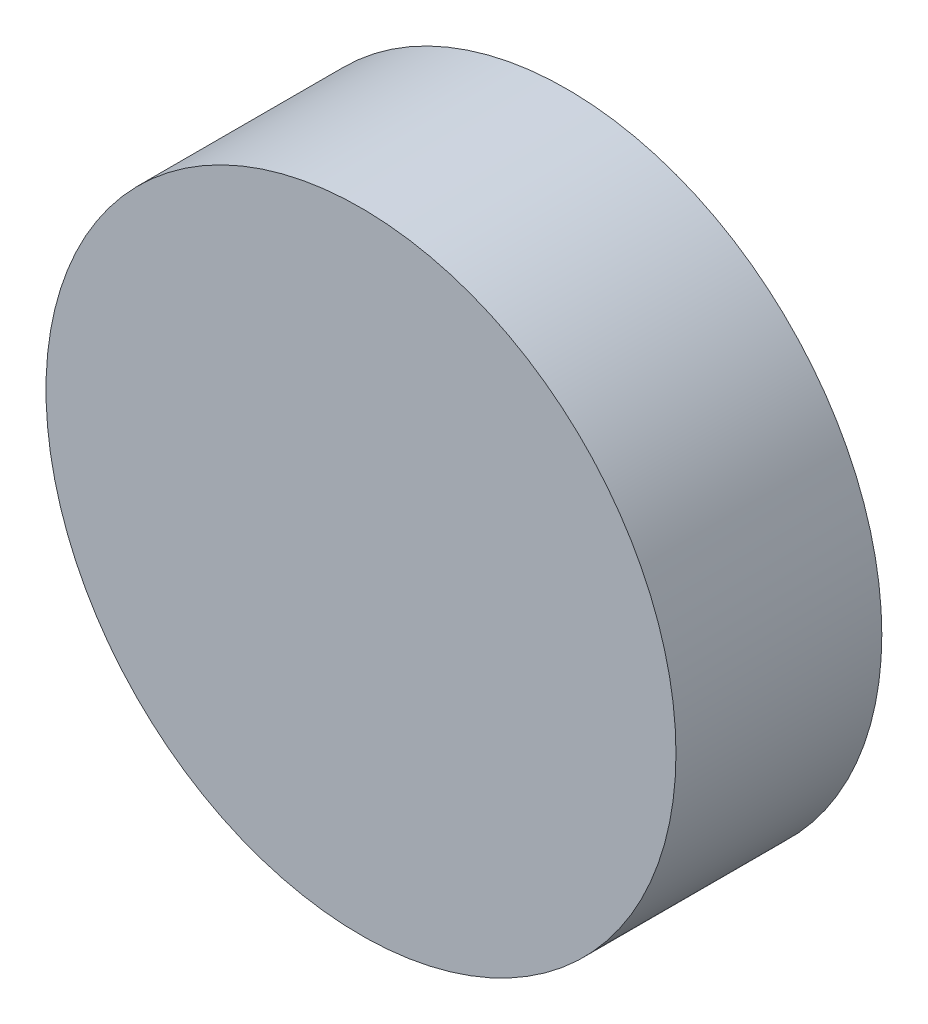
ISO-10303-21;
HEADER;
FILE_DESCRIPTION(('STEP AP214'),'2;1');
FILE_NAME('part.step','',(''),(''),'','','');
FILE_SCHEMA(('AUTOMOTIVE_DESIGN { 1 0 10303 214 1 1 1 1 }'));
ENDSEC;
DATA;
#1=APPLICATION_CONTEXT('core data for automotive mechanical design processes');
#2=APPLICATION_PROTOCOL_DEFINITION('international standard','automotive_design',2000,#1);
#3=PRODUCT_CONTEXT('',#1,'mechanical');
#4=PRODUCT('Part','Part','',(#3));
#5=PRODUCT_RELATED_PRODUCT_CATEGORY('part','',(#4));
#6=PRODUCT_DEFINITION_FORMATION('','',#4);
#7=PRODUCT_DEFINITION_CONTEXT('part definition',#1,'design');
#8=PRODUCT_DEFINITION('design','',#6,#7);
#9=PRODUCT_DEFINITION_SHAPE('','',#8);
#10=(LENGTH_UNIT() NAMED_UNIT(*) SI_UNIT(.MILLI.,.METRE.));
#11=(NAMED_UNIT(*) PLANE_ANGLE_UNIT() SI_UNIT($,.RADIAN.));
#12=(NAMED_UNIT(*) SI_UNIT($,.STERADIAN.) SOLID_ANGLE_UNIT());
#13=UNCERTAINTY_MEASURE_WITH_UNIT(LENGTH_MEASURE(1.E-05),#10,'distance_accuracy_value','');
#14=(GEOMETRIC_REPRESENTATION_CONTEXT(3) GLOBAL_UNCERTAINTY_ASSIGNED_CONTEXT((#13)) GLOBAL_UNIT_ASSIGNED_CONTEXT((#10,
#11,#12)) REPRESENTATION_CONTEXT('',''));
#15=CARTESIAN_POINT('',(0.,0.,0.));
#16=DIRECTION('',(0.,0.,1.));
#17=DIRECTION('',(1.,0.,0.));
#18=AXIS2_PLACEMENT_3D('',#15,#16,#17);
#19=CARTESIAN_POINT('',(0.,0.,0.));
#20=DIRECTION('',(0.,0.,1.));
#21=DIRECTION('',(1.,0.,0.));
#22=AXIS2_PLACEMENT_3D('',#19,#20,#21);
#23=PLANE('',#22);
#24=CARTESIAN_POINT('',(0.,0.,0.));
#25=DIRECTION('',(0.,0.,1.));
#26=DIRECTION('',(1.,0.,0.));
#27=AXIS2_PLACEMENT_3D('',#24,#25,#26);
#28=CIRCLE('',#27,81.1);
#29=CARTESIAN_POINT('',(81.1,0.,0.));
#30=VERTEX_POINT('',#29);
#31=EDGE_CURVE('E10',#30,#30,#28,.T.);
#32=ORIENTED_EDGE('',*,*,#31,.F.);
#33=EDGE_LOOP('',(#32));
#34=FACE_BOUND('',#33,.T.);
#35=CARTESIAN_POINT('',(0.,0.,0.));
#36=DIRECTION('',(0.,0.,1.));
#37=DIRECTION('',(1.,0.,0.));
#38=AXIS2_PLACEMENT_3D('',#35,#36,#37);
#39=CIRCLE('',#38,78.1);
#40=CARTESIAN_POINT('',(78.1,0.,0.));
#41=VERTEX_POINT('',#40);
#42=EDGE_CURVE('E45',#41,#41,#39,.T.);
#43=ORIENTED_EDGE('',*,*,#42,.T.);
#44=EDGE_LOOP('',(#43));
#45=FACE_BOUND('',#44,.T.);
#46=ADVANCED_FACE('F37',(#34,#45),#23,.F.);
#47=CARTESIAN_POINT('',(0.,0.,50.));
#48=DIRECTION('',(0.,0.,-1.));
#49=DIRECTION('',(-1.,0.,0.));
#50=AXIS2_PLACEMENT_3D('',#47,#48,#49);
#51=CYLINDRICAL_SURFACE('',#50,81.1);
#52=ORIENTED_EDGE('',*,*,#31,.T.);
#53=EDGE_LOOP('',(#52));
#54=FACE_BOUND('',#53,.T.);
#55=CARTESIAN_POINT('',(0.,0.,53.));
#56=DIRECTION('',(0.,0.,1.));
#57=DIRECTION('',(1.,0.,0.));
#58=AXIS2_PLACEMENT_3D('',#55,#56,#57);
#59=CIRCLE('',#58,81.1);
#60=CARTESIAN_POINT('',(81.1,0.,53.));
#61=VERTEX_POINT('',#60);
#62=EDGE_CURVE('E55',#61,#61,#59,.T.);
#63=ORIENTED_EDGE('',*,*,#62,.F.);
#64=EDGE_LOOP('',(#63));
#65=FACE_BOUND('',#64,.T.);
#66=ADVANCED_FACE('F39',(#54,#65),#51,.T.);
#67=CARTESIAN_POINT('',(0.,0.,50.));
#68=DIRECTION('',(0.,0.,-1.));
#69=DIRECTION('',(-1.,0.,0.));
#70=AXIS2_PLACEMENT_3D('',#67,#68,#69);
#71=CYLINDRICAL_SURFACE('',#70,78.1);
#72=CARTESIAN_POINT('',(0.,0.,50.));
#73=DIRECTION('',(0.,0.,1.));
#74=DIRECTION('',(1.,0.,0.));
#75=AXIS2_PLACEMENT_3D('',#72,#73,#74);
#76=CIRCLE('',#75,78.1);
#77=CARTESIAN_POINT('',(78.1,0.,50.));
#78=VERTEX_POINT('',#77);
#79=EDGE_CURVE('E50',#78,#78,#76,.T.);
#80=ORIENTED_EDGE('',*,*,#79,.T.);
#81=EDGE_LOOP('',(#80));
#82=FACE_BOUND('',#81,.T.);
#83=ORIENTED_EDGE('',*,*,#42,.F.);
#84=EDGE_LOOP('',(#83));
#85=FACE_BOUND('',#84,.T.);
#86=ADVANCED_FACE('F65',(#82,#85),#71,.F.);
#87=CARTESIAN_POINT('',(0.,0.,50.));
#88=DIRECTION('',(0.,0.,1.));
#89=DIRECTION('',(1.,0.,0.));
#90=AXIS2_PLACEMENT_3D('',#87,#88,#89);
#91=PLANE('',#90);
#92=ORIENTED_EDGE('',*,*,#79,.F.);
#93=EDGE_LOOP('',(#92));
#94=FACE_BOUND('',#93,.T.);
#95=ADVANCED_FACE('F70',(#94),#91,.F.);
#96=CARTESIAN_POINT('',(0.,0.,53.));
#97=DIRECTION('',(0.,0.,1.));
#98=DIRECTION('',(1.,0.,0.));
#99=AXIS2_PLACEMENT_3D('',#96,#97,#98);
#100=PLANE('',#99);
#101=ORIENTED_EDGE('',*,*,#62,.T.);
#102=EDGE_LOOP('',(#101));
#103=FACE_BOUND('',#102,.T.);
#104=ADVANCED_FACE('F62',(#103),#100,.T.);
#105=CLOSED_SHELL('',(#46,#66,#86,#95,#104));
#106=MANIFOLD_SOLID_BREP('B2',#105);
#107=ADVANCED_BREP_SHAPE_REPRESENTATION('',(#18,#106),#14);
#108=SHAPE_DEFINITION_REPRESENTATION(#9,#107);
ENDSEC;
END-ISO-10303-21;
